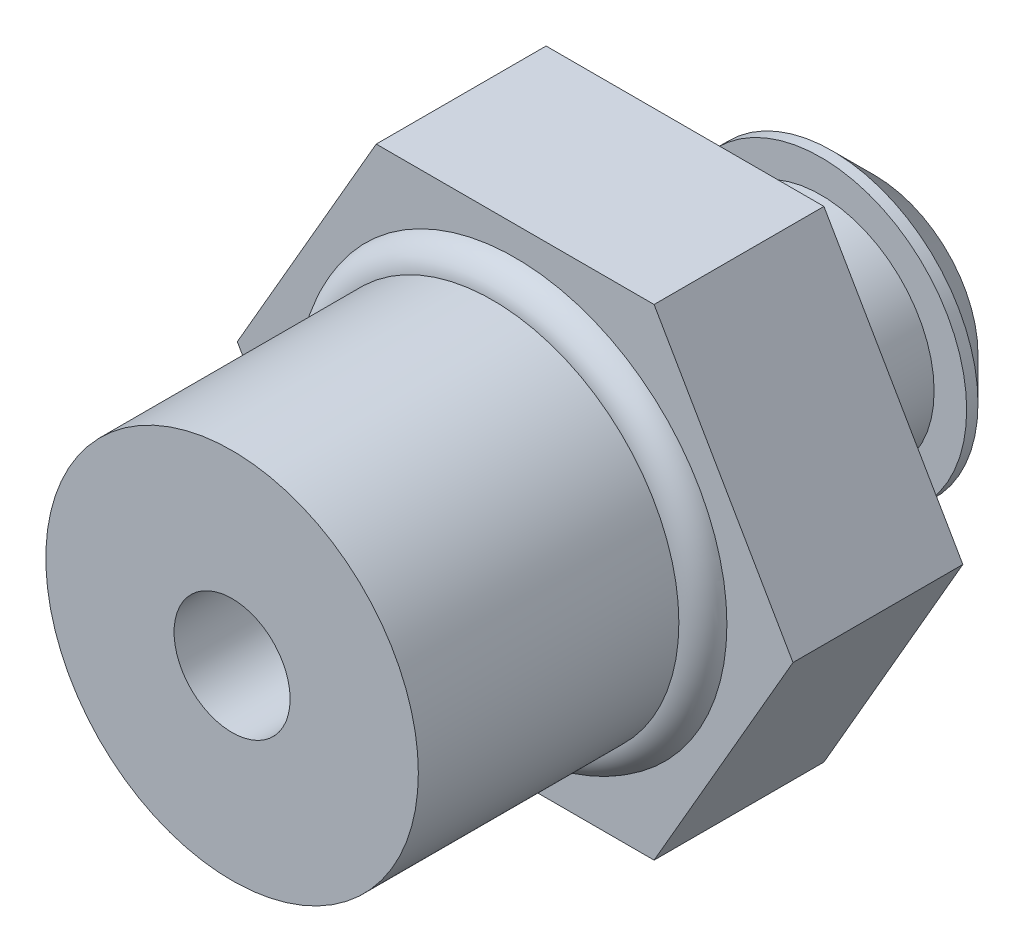
ISO-10303-21;
HEADER;
FILE_DESCRIPTION(('STEP AP214'),'2;1');
FILE_NAME('part.step','',(''),(''),'','','');
FILE_SCHEMA(('AUTOMOTIVE_DESIGN { 1 0 10303 214 1 1 1 1 }'));
ENDSEC;
DATA;
#1=APPLICATION_CONTEXT('core data for automotive mechanical design processes');
#2=APPLICATION_PROTOCOL_DEFINITION('international standard','automotive_design',2000,#1);
#3=PRODUCT_CONTEXT('',#1,'mechanical');
#4=PRODUCT('Part','Part','',(#3));
#5=PRODUCT_RELATED_PRODUCT_CATEGORY('part','',(#4));
#6=PRODUCT_DEFINITION_FORMATION('','',#4);
#7=PRODUCT_DEFINITION_CONTEXT('part definition',#1,'design');
#8=PRODUCT_DEFINITION('design','',#6,#7);
#9=PRODUCT_DEFINITION_SHAPE('','',#8);
#10=(LENGTH_UNIT() NAMED_UNIT(*) SI_UNIT(.MILLI.,.METRE.));
#11=(NAMED_UNIT(*) PLANE_ANGLE_UNIT() SI_UNIT($,.RADIAN.));
#12=(NAMED_UNIT(*) SI_UNIT($,.STERADIAN.) SOLID_ANGLE_UNIT());
#13=UNCERTAINTY_MEASURE_WITH_UNIT(LENGTH_MEASURE(1.E-05),#10,'distance_accuracy_value','');
#14=(GEOMETRIC_REPRESENTATION_CONTEXT(3) GLOBAL_UNCERTAINTY_ASSIGNED_CONTEXT((#13)) GLOBAL_UNIT_ASSIGNED_CONTEXT((#10,
#11,#12)) REPRESENTATION_CONTEXT('',''));
#15=CARTESIAN_POINT('',(0.,0.,0.));
#16=DIRECTION('',(0.,0.,1.));
#17=DIRECTION('',(1.,0.,0.));
#18=AXIS2_PLACEMENT_3D('',#15,#16,#17);
#19=CARTESIAN_POINT('',(4.90747728811182,-8.5,6.));
#20=DIRECTION('',(-0.866025403784439,0.5,0.));
#21=DIRECTION('',(0.,0.,1.));
#22=AXIS2_PLACEMENT_3D('',#19,#20,#21);
#23=PLANE('',#22);
#24=DIRECTION('',(-0.5,-0.866025403784439,0.));
#25=VECTOR('',#24,1.);
#26=CARTESIAN_POINT('',(4.98621593216773,-8.36362066797608,0.));
#27=LINE('',#26,#25);
#28=CARTESIAN_POINT('',(9.81495457622364,0.,0.));
#29=VERTEX_POINT('',#28);
#30=CARTESIAN_POINT('',(4.90747728811182,-8.5,0.));
#31=VERTEX_POINT('',#30);
#32=EDGE_CURVE('E321',#29,#31,#27,.T.);
#33=ORIENTED_EDGE('',*,*,#32,.F.);
#34=DIRECTION('',(0.,0.,1.));
#35=VECTOR('',#34,1.);
#36=CARTESIAN_POINT('',(9.81495457622364,0.,6.));
#37=LINE('',#36,#35);
#38=CARTESIAN_POINT('',(9.81495457622364,0.,6.));
#39=VERTEX_POINT('',#38);
#40=EDGE_CURVE('E11',#29,#39,#37,.T.);
#41=ORIENTED_EDGE('',*,*,#40,.T.);
#42=DIRECTION('',(0.5,0.866025403784439,0.));
#43=VECTOR('',#42,1.);
#44=CARTESIAN_POINT('',(4.90747728811182,-8.5,6.));
#45=LINE('',#44,#43);
#46=CARTESIAN_POINT('',(4.90747728811182,-8.5,6.));
#47=VERTEX_POINT('',#46);
#48=EDGE_CURVE('E219',#47,#39,#45,.T.);
#49=ORIENTED_EDGE('',*,*,#48,.F.);
#50=DIRECTION('',(0.,0.,-1.));
#51=VECTOR('',#50,1.);
#52=CARTESIAN_POINT('',(4.90747728811182,-8.5,6.));
#53=LINE('',#52,#51);
#54=EDGE_CURVE('E206',#47,#31,#53,.T.);
#55=ORIENTED_EDGE('',*,*,#54,.T.);
#56=EDGE_LOOP('',(#33,#41,#49,#55));
#57=FACE_BOUND('',#56,.T.);
#58=ADVANCED_FACE('F16',(#57),#23,.F.);
#59=CARTESIAN_POINT('',(9.81495457622364,0.,6.));
#60=DIRECTION('',(-0.866025403784439,-0.5,0.));
#61=DIRECTION('',(-0.5,0.866025403784439,0.));
#62=AXIS2_PLACEMENT_3D('',#59,#60,#61);
#63=PLANE('',#62);
#64=DIRECTION('',(0.5,-0.866025403784439,0.));
#65=VECTOR('',#64,1.);
#66=CARTESIAN_POINT('',(4.98621593216773,8.36362066797609,0.));
#67=LINE('',#66,#65);
#68=CARTESIAN_POINT('',(4.90747728811183,8.5,0.));
#69=VERTEX_POINT('',#68);
#70=EDGE_CURVE('E328',#69,#29,#67,.T.);
#71=ORIENTED_EDGE('',*,*,#70,.F.);
#72=DIRECTION('',(0.,0.,1.));
#73=VECTOR('',#72,1.);
#74=CARTESIAN_POINT('',(4.90747728811182,8.5,6.));
#75=LINE('',#74,#73);
#76=CARTESIAN_POINT('',(4.90747728811182,8.5,6.));
#77=VERTEX_POINT('',#76);
#78=EDGE_CURVE('E27',#69,#77,#75,.T.);
#79=ORIENTED_EDGE('',*,*,#78,.T.);
#80=DIRECTION('',(-0.5,0.866025403784439,0.));
#81=VECTOR('',#80,1.);
#82=CARTESIAN_POINT('',(9.81495457622364,0.,6.));
#83=LINE('',#82,#81);
#84=EDGE_CURVE('E224',#39,#77,#83,.T.);
#85=ORIENTED_EDGE('',*,*,#84,.F.);
#86=ORIENTED_EDGE('',*,*,#40,.F.);
#87=EDGE_LOOP('',(#71,#79,#85,#86));
#88=FACE_BOUND('',#87,.T.);
#89=ADVANCED_FACE('F717',(#88),#63,.F.);
#90=CARTESIAN_POINT('',(4.90747728811182,8.5,6.));
#91=DIRECTION('',(0.,-1.,0.));
#92=DIRECTION('',(-1.,0.,0.));
#93=AXIS2_PLACEMENT_3D('',#90,#91,#92);
#94=PLANE('',#93);
#95=DIRECTION('',(1.,0.,0.));
#96=VECTOR('',#95,1.);
#97=CARTESIAN_POINT('',(-9.5,8.5,0.));
#98=LINE('',#97,#96);
#99=CARTESIAN_POINT('',(-4.90747728811182,8.5,0.));
#100=VERTEX_POINT('',#99);
#101=EDGE_CURVE('E318',#100,#69,#98,.T.);
#102=ORIENTED_EDGE('',*,*,#101,.F.);
#103=DIRECTION('',(0.,0.,1.));
#104=VECTOR('',#103,1.);
#105=CARTESIAN_POINT('',(-4.90747728811182,8.5,6.));
#106=LINE('',#105,#104);
#107=CARTESIAN_POINT('',(-4.90747728811182,8.5,6.));
#108=VERTEX_POINT('',#107);
#109=EDGE_CURVE('E344',#100,#108,#106,.T.);
#110=ORIENTED_EDGE('',*,*,#109,.T.);
#111=DIRECTION('',(-1.,0.,0.));
#112=VECTOR('',#111,1.);
#113=CARTESIAN_POINT('',(4.90747728811182,8.5,6.));
#114=LINE('',#113,#112);
#115=EDGE_CURVE('E357',#77,#108,#114,.T.);
#116=ORIENTED_EDGE('',*,*,#115,.F.);
#117=ORIENTED_EDGE('',*,*,#78,.F.);
#118=EDGE_LOOP('',(#102,#110,#116,#117));
#119=FACE_BOUND('',#118,.T.);
#120=ADVANCED_FACE('F721',(#119),#94,.F.);
#121=CARTESIAN_POINT('',(-4.90747728811182,8.5,6.));
#122=DIRECTION('',(0.866025403784439,-0.5,0.));
#123=DIRECTION('',(0.,0.,-1.));
#124=AXIS2_PLACEMENT_3D('',#121,#122,#123);
#125=PLANE('',#124);
#126=DIRECTION('',(0.5,0.866025403784439,0.));
#127=VECTOR('',#126,1.);
#128=CARTESIAN_POINT('',(-9.73621593216773,0.136379332023917,0.));
#129=LINE('',#128,#127);
#130=CARTESIAN_POINT('',(-9.81495457622364,0.,0.));
#131=VERTEX_POINT('',#130);
#132=EDGE_CURVE('E310',#131,#100,#129,.T.);
#133=ORIENTED_EDGE('',*,*,#132,.F.);
#134=DIRECTION('',(0.,0.,1.));
#135=VECTOR('',#134,1.);
#136=CARTESIAN_POINT('',(-9.81495457622364,0.,6.));
#137=LINE('',#136,#135);
#138=CARTESIAN_POINT('',(-9.81495457622364,0.,6.));
#139=VERTEX_POINT('',#138);
#140=EDGE_CURVE('E347',#131,#139,#137,.T.);
#141=ORIENTED_EDGE('',*,*,#140,.T.);
#142=DIRECTION('',(-0.5,-0.866025403784439,0.));
#143=VECTOR('',#142,1.);
#144=CARTESIAN_POINT('',(-4.90747728811182,8.5,6.));
#145=LINE('',#144,#143);
#146=EDGE_CURVE('E404',#108,#139,#145,.T.);
#147=ORIENTED_EDGE('',*,*,#146,.F.);
#148=ORIENTED_EDGE('',*,*,#109,.F.);
#149=EDGE_LOOP('',(#133,#141,#147,#148));
#150=FACE_BOUND('',#149,.T.);
#151=ADVANCED_FACE('F850',(#150),#125,.F.);
#152=CARTESIAN_POINT('',(-9.81495457622364,0.,6.));
#153=DIRECTION('',(0.866025403784439,0.5,0.));
#154=DIRECTION('',(0.,0.,-1.));
#155=AXIS2_PLACEMENT_3D('',#152,#153,#154);
#156=PLANE('',#155);
#157=DIRECTION('',(-0.5,0.866025403784439,0.));
#158=VECTOR('',#157,1.);
#159=CARTESIAN_POINT('',(-9.73621593216773,-0.136379332023917,0.));
#160=LINE('',#159,#158);
#161=CARTESIAN_POINT('',(-4.90747728811182,-8.5,0.));
#162=VERTEX_POINT('',#161);
#163=EDGE_CURVE('E307',#162,#131,#160,.T.);
#164=ORIENTED_EDGE('',*,*,#163,.F.);
#165=DIRECTION('',(0.,0.,1.));
#166=VECTOR('',#165,1.);
#167=CARTESIAN_POINT('',(-4.90747728811182,-8.5,6.));
#168=LINE('',#167,#166);
#169=CARTESIAN_POINT('',(-4.90747728811182,-8.5,6.));
#170=VERTEX_POINT('',#169);
#171=EDGE_CURVE('E216',#162,#170,#168,.T.);
#172=ORIENTED_EDGE('',*,*,#171,.T.);
#173=DIRECTION('',(0.5,-0.866025403784439,0.));
#174=VECTOR('',#173,1.);
#175=CARTESIAN_POINT('',(-9.81495457622364,0.,6.));
#176=LINE('',#175,#174);
#177=EDGE_CURVE('E230',#139,#170,#176,.T.);
#178=ORIENTED_EDGE('',*,*,#177,.F.);
#179=ORIENTED_EDGE('',*,*,#140,.F.);
#180=EDGE_LOOP('',(#164,#172,#178,#179));
#181=FACE_BOUND('',#180,.T.);
#182=ADVANCED_FACE('F846',(#181),#156,.F.);
#183=CARTESIAN_POINT('',(-4.90747728811182,-8.5,6.));
#184=DIRECTION('',(0.,1.,0.));
#185=DIRECTION('',(1.,0.,0.));
#186=AXIS2_PLACEMENT_3D('',#183,#184,#185);
#187=PLANE('',#186);
#188=DIRECTION('',(-1.,0.,0.));
#189=VECTOR('',#188,1.);
#190=CARTESIAN_POINT('',(-9.5,-8.5,0.));
#191=LINE('',#190,#189);
#192=EDGE_CURVE('E211',#31,#162,#191,.T.);
#193=ORIENTED_EDGE('',*,*,#192,.F.);
#194=ORIENTED_EDGE('',*,*,#54,.F.);
#195=DIRECTION('',(1.,0.,0.));
#196=VECTOR('',#195,1.);
#197=CARTESIAN_POINT('',(-4.90747728811182,-8.5,6.));
#198=LINE('',#197,#196);
#199=EDGE_CURVE('E209',#170,#47,#198,.T.);
#200=ORIENTED_EDGE('',*,*,#199,.F.);
#201=ORIENTED_EDGE('',*,*,#171,.F.);
#202=EDGE_LOOP('',(#193,#194,#200,#201));
#203=FACE_BOUND('',#202,.T.);
#204=ADVANCED_FACE('F18',(#203),#187,.F.);
#205=CARTESIAN_POINT('',(2.30940107675851,0.,-0.7));
#206=DIRECTION('',(0.866025403784439,-0.5,0.));
#207=DIRECTION('',(0.,0.,-1.));
#208=AXIS2_PLACEMENT_3D('',#205,#206,#207);
#209=PLANE('',#208);
#210=DIRECTION('',(-0.5,-0.866025403784439,0.));
#211=VECTOR('',#210,1.);
#212=CARTESIAN_POINT('',(2.30940107675851,0.,-6.7));
#213=LINE('',#212,#211);
#214=CARTESIAN_POINT('',(2.30940107675851,0.,-6.7));
#215=VERTEX_POINT('',#214);
#216=CARTESIAN_POINT('',(1.15470053837925,-2.,-6.7));
#217=VERTEX_POINT('',#216);
#218=EDGE_CURVE('E333',#215,#217,#213,.T.);
#219=ORIENTED_EDGE('',*,*,#218,.T.);
#220=DIRECTION('',(0.,0.,-1.));
#221=VECTOR('',#220,1.);
#222=CARTESIAN_POINT('',(1.15470053837925,-2.,-0.7));
#223=LINE('',#222,#221);
#224=CARTESIAN_POINT('',(1.15470053837925,-2.,-0.7));
#225=VERTEX_POINT('',#224);
#226=EDGE_CURVE('E143',#225,#217,#223,.T.);
#227=ORIENTED_EDGE('',*,*,#226,.F.);
#228=DIRECTION('',(-0.5,-0.866025403784439,0.));
#229=VECTOR('',#228,1.);
#230=CARTESIAN_POINT('',(2.30940107675851,0.,-0.7));
#231=LINE('',#230,#229);
#232=CARTESIAN_POINT('',(1.50705080756889,-1.38971143170299,-0.7));
#233=VERTEX_POINT('',#232);
#234=EDGE_CURVE('E365',#233,#225,#231,.T.);
#235=ORIENTED_EDGE('',*,*,#234,.F.);
#236=DIRECTION('',(-0.5,-0.866025403784439,0.));
#237=VECTOR('',#236,1.);
#238=CARTESIAN_POINT('',(2.30940107675851,0.,-0.7));
#239=LINE('',#238,#237);
#240=CARTESIAN_POINT('',(1.95705080756887,-0.610288568297012,-0.7));
#241=VERTEX_POINT('',#240);
#242=EDGE_CURVE('E246',#241,#233,#239,.T.);
#243=ORIENTED_EDGE('',*,*,#242,.F.);
#244=DIRECTION('',(-0.5,-0.866025403784439,0.));
#245=VECTOR('',#244,1.);
#246=CARTESIAN_POINT('',(2.30940107675851,0.,-0.7));
#247=LINE('',#246,#245);
#248=CARTESIAN_POINT('',(2.30940107675851,0.,-0.7));
#249=VERTEX_POINT('',#248);
#250=EDGE_CURVE('E283',#249,#241,#247,.T.);
#251=ORIENTED_EDGE('',*,*,#250,.F.);
#252=DIRECTION('',(0.,0.,-1.));
#253=VECTOR('',#252,1.);
#254=CARTESIAN_POINT('',(2.30940107675851,0.,-0.7));
#255=LINE('',#254,#253);
#256=EDGE_CURVE('E354',#249,#215,#255,.T.);
#257=ORIENTED_EDGE('',*,*,#256,.T.);
#258=EDGE_LOOP('',(#219,#227,#235,#243,#251,#257));
#259=FACE_BOUND('',#258,.T.);
#260=ADVANCED_FACE('F510',(#259),#209,.F.);
#261=CARTESIAN_POINT('',(1.15470053837925,-2.,-0.7));
#262=DIRECTION('',(0.,-1.,0.));
#263=DIRECTION('',(0.,0.,-1.));
#264=AXIS2_PLACEMENT_3D('',#261,#262,#263);
#265=PLANE('',#264);
#266=DIRECTION('',(-1.,0.,0.));
#267=VECTOR('',#266,1.);
#268=CARTESIAN_POINT('',(1.15470053837925,-2.,-6.7));
#269=LINE('',#268,#267);
#270=CARTESIAN_POINT('',(-1.15470053837925,-2.,-6.7));
#271=VERTEX_POINT('',#270);
#272=EDGE_CURVE('E250',#217,#271,#269,.T.);
#273=ORIENTED_EDGE('',*,*,#272,.T.);
#274=DIRECTION('',(0.,0.,-1.));
#275=VECTOR('',#274,1.);
#276=CARTESIAN_POINT('',(-1.15470053837925,-2.,-0.7));
#277=LINE('',#276,#275);
#278=CARTESIAN_POINT('',(-1.15470053837925,-2.,-0.7));
#279=VERTEX_POINT('',#278);
#280=EDGE_CURVE('E20',#279,#271,#277,.T.);
#281=ORIENTED_EDGE('',*,*,#280,.F.);
#282=DIRECTION('',(-1.,0.,0.));
#283=VECTOR('',#282,1.);
#284=CARTESIAN_POINT('',(1.15470053837925,-2.,-0.7));
#285=LINE('',#284,#283);
#286=CARTESIAN_POINT('',(-0.449999999999988,-2.,-0.7));
#287=VERTEX_POINT('',#286);
#288=EDGE_CURVE('E249',#287,#279,#285,.T.);
#289=ORIENTED_EDGE('',*,*,#288,.F.);
#290=DIRECTION('',(-1.,0.,0.));
#291=VECTOR('',#290,1.);
#292=CARTESIAN_POINT('',(1.15470053837925,-2.,-0.7));
#293=LINE('',#292,#291);
#294=CARTESIAN_POINT('',(0.449999999999989,-2.,-0.7));
#295=VERTEX_POINT('',#294);
#296=EDGE_CURVE('E232',#295,#287,#293,.T.);
#297=ORIENTED_EDGE('',*,*,#296,.F.);
#298=DIRECTION('',(-1.,0.,0.));
#299=VECTOR('',#298,1.);
#300=CARTESIAN_POINT('',(1.15470053837925,-2.,-0.7));
#301=LINE('',#300,#299);
#302=EDGE_CURVE('E363',#225,#295,#301,.T.);
#303=ORIENTED_EDGE('',*,*,#302,.F.);
#304=ORIENTED_EDGE('',*,*,#226,.T.);
#305=EDGE_LOOP('',(#273,#281,#289,#297,#303,#304));
#306=FACE_BOUND('',#305,.T.);
#307=ADVANCED_FACE('F627',(#306),#265,.F.);
#308=CARTESIAN_POINT('',(-1.15470053837925,-2.,-0.7));
#309=DIRECTION('',(-0.866025403784439,-0.5,0.));
#310=DIRECTION('',(-0.5,0.866025403784439,0.));
#311=AXIS2_PLACEMENT_3D('',#308,#309,#310);
#312=PLANE('',#311);
#313=DIRECTION('',(-0.5,0.866025403784439,0.));
#314=VECTOR('',#313,1.);
#315=CARTESIAN_POINT('',(-1.15470053837925,-2.,-6.7));
#316=LINE('',#315,#314);
#317=CARTESIAN_POINT('',(-2.3094010767585,0.,-6.7));
#318=VERTEX_POINT('',#317);
#319=EDGE_CURVE('E251',#271,#318,#316,.T.);
#320=ORIENTED_EDGE('',*,*,#319,.T.);
#321=DIRECTION('',(0.,0.,-1.));
#322=VECTOR('',#321,1.);
#323=CARTESIAN_POINT('',(-2.3094010767585,0.,-0.7));
#324=LINE('',#323,#322);
#325=CARTESIAN_POINT('',(-2.3094010767585,0.,-0.7));
#326=VERTEX_POINT('',#325);
#327=EDGE_CURVE('E42',#326,#318,#324,.T.);
#328=ORIENTED_EDGE('',*,*,#327,.F.);
#329=DIRECTION('',(-0.5,0.866025403784439,0.));
#330=VECTOR('',#329,1.);
#331=CARTESIAN_POINT('',(-1.15470053837925,-2.,-0.7));
#332=LINE('',#331,#330);
#333=CARTESIAN_POINT('',(-1.95705080756887,-0.610288568297001,-0.7));
#334=VERTEX_POINT('',#333);
#335=EDGE_CURVE('E292',#334,#326,#332,.T.);
#336=ORIENTED_EDGE('',*,*,#335,.F.);
#337=DIRECTION('',(-0.5,0.866025403784439,0.));
#338=VECTOR('',#337,1.);
#339=CARTESIAN_POINT('',(-1.15470053837925,-2.,-0.7));
#340=LINE('',#339,#338);
#341=CARTESIAN_POINT('',(-1.50705080756888,-1.38971143170299,-0.7));
#342=VERTEX_POINT('',#341);
#343=EDGE_CURVE('E240',#342,#334,#340,.T.);
#344=ORIENTED_EDGE('',*,*,#343,.F.);
#345=DIRECTION('',(-0.5,0.866025403784439,0.));
#346=VECTOR('',#345,1.);
#347=CARTESIAN_POINT('',(-1.15470053837925,-2.,-0.7));
#348=LINE('',#347,#346);
#349=EDGE_CURVE('E419',#279,#342,#348,.T.);
#350=ORIENTED_EDGE('',*,*,#349,.F.);
#351=ORIENTED_EDGE('',*,*,#280,.T.);
#352=EDGE_LOOP('',(#320,#328,#336,#344,#350,#351));
#353=FACE_BOUND('',#352,.T.);
#354=ADVANCED_FACE('F631',(#353),#312,.F.);
#355=CARTESIAN_POINT('',(-2.3094010767585,0.,-0.7));
#356=DIRECTION('',(-0.866025403784439,0.5,0.));
#357=DIRECTION('',(0.,0.,1.));
#358=AXIS2_PLACEMENT_3D('',#355,#356,#357);
#359=PLANE('',#358);
#360=DIRECTION('',(0.5,0.866025403784439,0.));
#361=VECTOR('',#360,1.);
#362=CARTESIAN_POINT('',(-2.3094010767585,0.,-6.7));
#363=LINE('',#362,#361);
#364=CARTESIAN_POINT('',(-1.15470053837925,2.,-6.7));
#365=VERTEX_POINT('',#364);
#366=EDGE_CURVE('E254',#318,#365,#363,.T.);
#367=ORIENTED_EDGE('',*,*,#366,.T.);
#368=DIRECTION('',(0.,0.,-1.));
#369=VECTOR('',#368,1.);
#370=CARTESIAN_POINT('',(-1.15470053837925,2.,-0.7));
#371=LINE('',#370,#369);
#372=CARTESIAN_POINT('',(-1.15470053837925,2.,-0.7));
#373=VERTEX_POINT('',#372);
#374=EDGE_CURVE('E265',#373,#365,#371,.T.);
#375=ORIENTED_EDGE('',*,*,#374,.F.);
#376=DIRECTION('',(0.5,0.866025403784439,0.));
#377=VECTOR('',#376,1.);
#378=CARTESIAN_POINT('',(-2.3094010767585,0.,-0.7));
#379=LINE('',#378,#377);
#380=CARTESIAN_POINT('',(-1.50705080756888,1.38971143170299,-0.7));
#381=VERTEX_POINT('',#380);
#382=EDGE_CURVE('E258',#381,#373,#379,.T.);
#383=ORIENTED_EDGE('',*,*,#382,.F.);
#384=DIRECTION('',(0.5,0.866025403784439,0.));
#385=VECTOR('',#384,1.);
#386=CARTESIAN_POINT('',(-2.3094010767585,0.,-0.7));
#387=LINE('',#386,#385);
#388=CARTESIAN_POINT('',(-1.95705080756887,0.610288568297003,-0.7));
#389=VERTEX_POINT('',#388);
#390=EDGE_CURVE('E284',#389,#381,#387,.T.);
#391=ORIENTED_EDGE('',*,*,#390,.F.);
#392=DIRECTION('',(0.5,0.866025403784439,0.));
#393=VECTOR('',#392,1.);
#394=CARTESIAN_POINT('',(-2.3094010767585,0.,-0.7));
#395=LINE('',#394,#393);
#396=EDGE_CURVE('E387',#326,#389,#395,.T.);
#397=ORIENTED_EDGE('',*,*,#396,.F.);
#398=ORIENTED_EDGE('',*,*,#327,.T.);
#399=EDGE_LOOP('',(#367,#375,#383,#391,#397,#398));
#400=FACE_BOUND('',#399,.T.);
#401=ADVANCED_FACE('F460',(#400),#359,.F.);
#402=CARTESIAN_POINT('',(-1.15470053837925,2.,-0.7));
#403=DIRECTION('',(0.,1.,0.));
#404=DIRECTION('',(1.,0.,0.));
#405=AXIS2_PLACEMENT_3D('',#402,#403,#404);
#406=PLANE('',#405);
#407=DIRECTION('',(1.,0.,0.));
#408=VECTOR('',#407,1.);
#409=CARTESIAN_POINT('',(-1.15470053837925,2.,-6.7));
#410=LINE('',#409,#408);
#411=CARTESIAN_POINT('',(1.15470053837925,2.,-6.7));
#412=VERTEX_POINT('',#411);
#413=EDGE_CURVE('E275',#365,#412,#410,.T.);
#414=ORIENTED_EDGE('',*,*,#413,.T.);
#415=DIRECTION('',(0.,0.,-1.));
#416=VECTOR('',#415,1.);
#417=CARTESIAN_POINT('',(1.15470053837925,2.,-0.7));
#418=LINE('',#417,#416);
#419=CARTESIAN_POINT('',(1.15470053837925,2.,-0.7));
#420=VERTEX_POINT('',#419);
#421=EDGE_CURVE('E268',#420,#412,#418,.T.);
#422=ORIENTED_EDGE('',*,*,#421,.F.);
#423=DIRECTION('',(1.,0.,0.));
#424=VECTOR('',#423,1.);
#425=CARTESIAN_POINT('',(-1.15470053837925,2.,-0.7));
#426=LINE('',#425,#424);
#427=CARTESIAN_POINT('',(0.449999999999989,2.,-0.7));
#428=VERTEX_POINT('',#427);
#429=EDGE_CURVE('E259',#428,#420,#426,.T.);
#430=ORIENTED_EDGE('',*,*,#429,.F.);
#431=DIRECTION('',(1.,0.,0.));
#432=VECTOR('',#431,1.);
#433=CARTESIAN_POINT('',(-1.15470053837925,2.,-0.7));
#434=LINE('',#433,#432);
#435=CARTESIAN_POINT('',(-0.449999999999989,2.,-0.7));
#436=VERTEX_POINT('',#435);
#437=EDGE_CURVE('E288',#436,#428,#434,.T.);
#438=ORIENTED_EDGE('',*,*,#437,.F.);
#439=DIRECTION('',(1.,0.,0.));
#440=VECTOR('',#439,1.);
#441=CARTESIAN_POINT('',(-1.15470053837925,2.,-0.7));
#442=LINE('',#441,#440);
#443=EDGE_CURVE('E289',#373,#436,#442,.T.);
#444=ORIENTED_EDGE('',*,*,#443,.F.);
#445=ORIENTED_EDGE('',*,*,#374,.T.);
#446=EDGE_LOOP('',(#414,#422,#430,#438,#444,#445));
#447=FACE_BOUND('',#446,.T.);
#448=ADVANCED_FACE('F455',(#447),#406,.F.);
#449=CARTESIAN_POINT('',(1.15470053837925,2.,-0.7));
#450=DIRECTION('',(0.866025403784439,0.5,0.));
#451=DIRECTION('',(0.,0.,-1.));
#452=AXIS2_PLACEMENT_3D('',#449,#450,#451);
#453=PLANE('',#452);
#454=DIRECTION('',(0.5,-0.866025403784439,0.));
#455=VECTOR('',#454,1.);
#456=CARTESIAN_POINT('',(1.15470053837925,2.,-6.7));
#457=LINE('',#456,#455);
#458=EDGE_CURVE('E279',#412,#215,#457,.T.);
#459=ORIENTED_EDGE('',*,*,#458,.T.);
#460=ORIENTED_EDGE('',*,*,#256,.F.);
#461=DIRECTION('',(0.5,-0.866025403784439,0.));
#462=VECTOR('',#461,1.);
#463=CARTESIAN_POINT('',(1.15470053837925,2.,-0.7));
#464=LINE('',#463,#462);
#465=CARTESIAN_POINT('',(1.95705080756887,0.610288568297011,-0.7));
#466=VERTEX_POINT('',#465);
#467=EDGE_CURVE('E360',#466,#249,#464,.T.);
#468=ORIENTED_EDGE('',*,*,#467,.F.);
#469=DIRECTION('',(0.5,-0.866025403784439,0.));
#470=VECTOR('',#469,1.);
#471=CARTESIAN_POINT('',(1.15470053837925,2.,-0.7));
#472=LINE('',#471,#470);
#473=CARTESIAN_POINT('',(1.50705080756888,1.38971143170299,-0.7));
#474=VERTEX_POINT('',#473);
#475=EDGE_CURVE('E263',#474,#466,#472,.T.);
#476=ORIENTED_EDGE('',*,*,#475,.F.);
#477=DIRECTION('',(0.5,-0.866025403784439,0.));
#478=VECTOR('',#477,1.);
#479=CARTESIAN_POINT('',(1.15470053837925,2.,-0.7));
#480=LINE('',#479,#478);
#481=EDGE_CURVE('E255',#420,#474,#480,.T.);
#482=ORIENTED_EDGE('',*,*,#481,.F.);
#483=ORIENTED_EDGE('',*,*,#421,.T.);
#484=EDGE_LOOP('',(#459,#460,#468,#476,#482,#483));
#485=FACE_BOUND('',#484,.T.);
#486=ADVANCED_FACE('F513',(#485),#453,.F.);
#487=CARTESIAN_POINT('',(0.,0.,-0.7));
#488=DIRECTION('',(0.,0.,-1.));
#489=DIRECTION('',(0.,-1.,0.));
#490=AXIS2_PLACEMENT_3D('',#487,#488,#489);
#491=PLANE('',#490);
#492=CARTESIAN_POINT('',(0.,0.,-0.7));
#493=DIRECTION('',(0.,0.,1.));
#494=DIRECTION('',(1.,0.,0.));
#495=AXIS2_PLACEMENT_3D('',#492,#493,#494);
#496=CIRCLE('',#495,2.05);
#497=EDGE_CURVE('E305',#389,#334,#496,.T.);
#498=ORIENTED_EDGE('',*,*,#497,.T.);
#499=ORIENTED_EDGE('',*,*,#335,.T.);
#500=ORIENTED_EDGE('',*,*,#396,.T.);
#501=EDGE_LOOP('',(#498,#499,#500));
#502=FACE_BOUND('',#501,.T.);
#503=ADVANCED_FACE('F646',(#502),#491,.T.);
#504=CARTESIAN_POINT('',(0.,0.,-0.7));
#505=DIRECTION('',(0.,0.,-1.));
#506=DIRECTION('',(0.,-1.,0.));
#507=AXIS2_PLACEMENT_3D('',#504,#505,#506);
#508=PLANE('',#507);
#509=CARTESIAN_POINT('',(0.,0.,-0.7));
#510=DIRECTION('',(0.,0.,1.));
#511=DIRECTION('',(1.,0.,0.));
#512=AXIS2_PLACEMENT_3D('',#509,#510,#511);
#513=CIRCLE('',#512,2.05);
#514=EDGE_CURVE('E244',#436,#381,#513,.T.);
#515=ORIENTED_EDGE('',*,*,#514,.T.);
#516=ORIENTED_EDGE('',*,*,#382,.T.);
#517=ORIENTED_EDGE('',*,*,#443,.T.);
#518=EDGE_LOOP('',(#515,#516,#517));
#519=FACE_BOUND('',#518,.T.);
#520=ADVANCED_FACE('F454',(#519),#508,.T.);
#521=CARTESIAN_POINT('',(0.,0.,-0.7));
#522=DIRECTION('',(0.,0.,-1.));
#523=DIRECTION('',(0.,-1.,0.));
#524=AXIS2_PLACEMENT_3D('',#521,#522,#523);
#525=PLANE('',#524);
#526=CARTESIAN_POINT('',(0.,0.,-0.7));
#527=DIRECTION('',(0.,0.,1.));
#528=DIRECTION('',(1.,0.,0.));
#529=AXIS2_PLACEMENT_3D('',#526,#527,#528);
#530=CIRCLE('',#529,2.05);
#531=EDGE_CURVE('E269',#474,#428,#530,.T.);
#532=ORIENTED_EDGE('',*,*,#531,.T.);
#533=ORIENTED_EDGE('',*,*,#429,.T.);
#534=ORIENTED_EDGE('',*,*,#481,.T.);
#535=EDGE_LOOP('',(#532,#533,#534));
#536=FACE_BOUND('',#535,.T.);
#537=ADVANCED_FACE('F445',(#536),#525,.T.);
#538=CARTESIAN_POINT('',(0.,0.,-0.7));
#539=DIRECTION('',(0.,0.,-1.));
#540=DIRECTION('',(0.,-1.,0.));
#541=AXIS2_PLACEMENT_3D('',#538,#539,#540);
#542=PLANE('',#541);
#543=CARTESIAN_POINT('',(0.,0.,-0.7));
#544=DIRECTION('',(0.,0.,1.));
#545=DIRECTION('',(1.,0.,0.));
#546=AXIS2_PLACEMENT_3D('',#543,#544,#545);
#547=CIRCLE('',#546,2.05);
#548=EDGE_CURVE('E297',#241,#466,#547,.T.);
#549=ORIENTED_EDGE('',*,*,#548,.T.);
#550=ORIENTED_EDGE('',*,*,#467,.T.);
#551=ORIENTED_EDGE('',*,*,#250,.T.);
#552=EDGE_LOOP('',(#549,#550,#551));
#553=FACE_BOUND('',#552,.T.);
#554=ADVANCED_FACE('F520',(#553),#542,.T.);
#555=CARTESIAN_POINT('',(0.,0.,-0.7));
#556=DIRECTION('',(0.,0.,-1.));
#557=DIRECTION('',(0.,-1.,0.));
#558=AXIS2_PLACEMENT_3D('',#555,#556,#557);
#559=PLANE('',#558);
#560=CARTESIAN_POINT('',(0.,0.,-0.7));
#561=DIRECTION('',(0.,0.,1.));
#562=DIRECTION('',(1.,0.,0.));
#563=AXIS2_PLACEMENT_3D('',#560,#561,#562);
#564=CIRCLE('',#563,2.05);
#565=EDGE_CURVE('E393',#295,#233,#564,.T.);
#566=ORIENTED_EDGE('',*,*,#565,.T.);
#567=ORIENTED_EDGE('',*,*,#234,.T.);
#568=ORIENTED_EDGE('',*,*,#302,.T.);
#569=EDGE_LOOP('',(#566,#567,#568));
#570=FACE_BOUND('',#569,.T.);
#571=ADVANCED_FACE('F673',(#570),#559,.T.);
#572=CARTESIAN_POINT('',(0.,0.,-0.7));
#573=DIRECTION('',(0.,0.,-1.));
#574=DIRECTION('',(0.,-1.,0.));
#575=AXIS2_PLACEMENT_3D('',#572,#573,#574);
#576=PLANE('',#575);
#577=CARTESIAN_POINT('',(0.,0.,-0.7));
#578=DIRECTION('',(0.,0.,1.));
#579=DIRECTION('',(1.,0.,0.));
#580=AXIS2_PLACEMENT_3D('',#577,#578,#579);
#581=CIRCLE('',#580,2.05);
#582=EDGE_CURVE('E306',#342,#287,#581,.T.);
#583=ORIENTED_EDGE('',*,*,#582,.T.);
#584=ORIENTED_EDGE('',*,*,#288,.T.);
#585=ORIENTED_EDGE('',*,*,#349,.T.);
#586=EDGE_LOOP('',(#583,#584,#585));
#587=FACE_BOUND('',#586,.T.);
#588=ADVANCED_FACE('F654',(#587),#576,.T.);
#589=CARTESIAN_POINT('',(-1.25,0.,-0.7));
#590=DIRECTION('',(0.,0.,-1.));
#591=DIRECTION('',(0.,-1.,0.));
#592=AXIS2_PLACEMENT_3D('',#589,#590,#591);
#593=PLANE('',#592);
#594=CARTESIAN_POINT('',(0.,0.,-0.7));
#595=DIRECTION('',(0.,0.,1.));
#596=DIRECTION('',(1.,0.,0.));
#597=AXIS2_PLACEMENT_3D('',#594,#595,#596);
#598=CIRCLE('',#597,2.05);
#599=EDGE_CURVE('E301',#233,#241,#598,.T.);
#600=ORIENTED_EDGE('',*,*,#599,.T.);
#601=ORIENTED_EDGE('',*,*,#242,.T.);
#602=EDGE_LOOP('',(#600,#601));
#603=FACE_BOUND('',#602,.T.);
#604=ADVANCED_FACE('F523',(#603),#593,.F.);
#605=CARTESIAN_POINT('',(-3.65,0.,-6.7));
#606=DIRECTION('',(0.,0.,1.));
#607=DIRECTION('',(1.,0.,0.));
#608=AXIS2_PLACEMENT_3D('',#605,#606,#607);
#609=PLANE('',#608);
#610=ORIENTED_EDGE('',*,*,#218,.F.);
#611=ORIENTED_EDGE('',*,*,#458,.F.);
#612=ORIENTED_EDGE('',*,*,#413,.F.);
#613=ORIENTED_EDGE('',*,*,#366,.F.);
#614=ORIENTED_EDGE('',*,*,#319,.F.);
#615=ORIENTED_EDGE('',*,*,#272,.F.);
#616=EDGE_LOOP('',(#610,#611,#612,#613,#614,#615));
#617=FACE_BOUND('',#616,.T.);
#618=CARTESIAN_POINT('',(0.,0.,-6.7));
#619=DIRECTION('',(0.,0.,1.));
#620=DIRECTION('',(1.,0.,0.));
#621=AXIS2_PLACEMENT_3D('',#618,#619,#620);
#622=CIRCLE('',#621,3.65);
#623=CARTESIAN_POINT('',(-3.65,0.,-6.7));
#624=VERTEX_POINT('',#623);
#625=EDGE_CURVE('E335',#624,#624,#622,.T.);
#626=ORIENTED_EDGE('',*,*,#625,.F.);
#627=EDGE_LOOP('',(#626));
#628=FACE_BOUND('',#627,.T.);
#629=ADVANCED_FACE('F464',(#617,#628),#609,.F.);
#630=CARTESIAN_POINT('',(-4.,0.,-4.8));
#631=DIRECTION('',(0.,0.,-1.));
#632=DIRECTION('',(0.,-1.,0.));
#633=AXIS2_PLACEMENT_3D('',#630,#631,#632);
#634=PLANE('',#633);
#635=CARTESIAN_POINT('',(0.,0.,-4.8));
#636=DIRECTION('',(0.,0.,1.));
#637=DIRECTION('',(1.,0.,0.));
#638=AXIS2_PLACEMENT_3D('',#635,#636,#637);
#639=CIRCLE('',#638,4.);
#640=CARTESIAN_POINT('',(-4.,0.,-4.8));
#641=VERTEX_POINT('',#640);
#642=EDGE_CURVE('E403',#641,#641,#639,.T.);
#643=ORIENTED_EDGE('',*,*,#642,.F.);
#644=EDGE_LOOP('',(#643));
#645=FACE_BOUND('',#644,.T.);
#646=CARTESIAN_POINT('',(0.,0.,-4.79999999999994));
#647=DIRECTION('',(0.,0.,1.));
#648=DIRECTION('',(1.,0.,0.));
#649=AXIS2_PLACEMENT_3D('',#646,#647,#648);
#650=CIRCLE('',#649,5.15);
#651=CARTESIAN_POINT('',(5.15,0.,-4.79999999999994));
#652=VERTEX_POINT('',#651);
#653=EDGE_CURVE('E431',#652,#652,#650,.T.);
#654=ORIENTED_EDGE('',*,*,#653,.T.);
#655=EDGE_LOOP('',(#654));
#656=FACE_BOUND('',#655,.T.);
#657=ADVANCED_FACE('F622',(#645,#656),#634,.F.);
#658=CARTESIAN_POINT('',(-9.5,0.,0.));
#659=DIRECTION('',(0.,0.,1.));
#660=DIRECTION('',(1.,0.,0.));
#661=AXIS2_PLACEMENT_3D('',#658,#659,#660);
#662=PLANE('',#661);
#663=CARTESIAN_POINT('',(0.,0.,0.));
#664=DIRECTION('',(0.,0.,1.));
#665=DIRECTION('',(1.,0.,0.));
#666=AXIS2_PLACEMENT_3D('',#663,#664,#665);
#667=CIRCLE('',#666,4.);
#668=CARTESIAN_POINT('',(4.,0.,0.));
#669=VERTEX_POINT('',#668);
#670=EDGE_CURVE('E296',#669,#669,#667,.T.);
#671=ORIENTED_EDGE('',*,*,#670,.T.);
#672=EDGE_LOOP('',(#671));
#673=FACE_BOUND('',#672,.T.);
#674=ORIENTED_EDGE('',*,*,#70,.T.);
#675=ORIENTED_EDGE('',*,*,#32,.T.);
#676=ORIENTED_EDGE('',*,*,#192,.T.);
#677=ORIENTED_EDGE('',*,*,#163,.T.);
#678=ORIENTED_EDGE('',*,*,#132,.T.);
#679=ORIENTED_EDGE('',*,*,#101,.T.);
#680=EDGE_LOOP('',(#674,#675,#676,#677,#678,#679));
#681=FACE_BOUND('',#680,.T.);
#682=ADVANCED_FACE('F752',(#673,#681),#662,.F.);
#683=CARTESIAN_POINT('',(-5.65,0.,6.));
#684=DIRECTION('',(0.,0.,-1.));
#685=DIRECTION('',(0.,-1.,0.));
#686=AXIS2_PLACEMENT_3D('',#683,#684,#685);
#687=PLANE('',#686);
#688=CARTESIAN_POINT('',(0.,0.,6.));
#689=DIRECTION('',(0.,0.,-1.));
#690=DIRECTION('',(-1.,0.,0.));
#691=AXIS2_PLACEMENT_3D('',#688,#689,#690);
#692=CIRCLE('',#691,7.47979589711327);
#693=CARTESIAN_POINT('',(-7.47979589711327,0.,6.));
#694=VERTEX_POINT('',#693);
#695=EDGE_CURVE('E260',#694,#694,#692,.T.);
#696=ORIENTED_EDGE('',*,*,#695,.T.);
#697=EDGE_LOOP('',(#696));
#698=FACE_BOUND('',#697,.T.);
#699=ORIENTED_EDGE('',*,*,#199,.T.);
#700=ORIENTED_EDGE('',*,*,#48,.T.);
#701=ORIENTED_EDGE('',*,*,#84,.T.);
#702=ORIENTED_EDGE('',*,*,#115,.T.);
#703=ORIENTED_EDGE('',*,*,#146,.T.);
#704=ORIENTED_EDGE('',*,*,#177,.T.);
#705=EDGE_LOOP('',(#699,#700,#701,#702,#703,#704));
#706=FACE_BOUND('',#705,.T.);
#707=ADVANCED_FACE('F227',(#698,#706),#687,.F.);
#708=CARTESIAN_POINT('',(-1.25,0.,-0.7));
#709=DIRECTION('',(0.,0.,-1.));
#710=DIRECTION('',(0.,-1.,0.));
#711=AXIS2_PLACEMENT_3D('',#708,#709,#710);
#712=PLANE('',#711);
#713=CARTESIAN_POINT('',(0.,0.,-0.7));
#714=DIRECTION('',(0.,0.,1.));
#715=DIRECTION('',(1.,0.,0.));
#716=AXIS2_PLACEMENT_3D('',#713,#714,#715);
#717=CIRCLE('',#716,2.05);
#718=EDGE_CURVE('E397',#287,#295,#717,.T.);
#719=ORIENTED_EDGE('',*,*,#718,.T.);
#720=ORIENTED_EDGE('',*,*,#296,.T.);
#721=EDGE_LOOP('',(#719,#720));
#722=FACE_BOUND('',#721,.T.);
#723=ADVANCED_FACE('F734',(#722),#712,.F.);
#724=CARTESIAN_POINT('',(-1.25,0.,-0.7));
#725=DIRECTION('',(0.,0.,-1.));
#726=DIRECTION('',(0.,-1.,0.));
#727=AXIS2_PLACEMENT_3D('',#724,#725,#726);
#728=PLANE('',#727);
#729=CARTESIAN_POINT('',(0.,0.,-0.7));
#730=DIRECTION('',(0.,0.,1.));
#731=DIRECTION('',(1.,0.,0.));
#732=AXIS2_PLACEMENT_3D('',#729,#730,#731);
#733=CIRCLE('',#732,2.05);
#734=EDGE_CURVE('E302',#334,#342,#733,.T.);
#735=ORIENTED_EDGE('',*,*,#734,.T.);
#736=ORIENTED_EDGE('',*,*,#343,.T.);
#737=EDGE_LOOP('',(#735,#736));
#738=FACE_BOUND('',#737,.T.);
#739=ADVANCED_FACE('F738',(#738),#728,.F.);
#740=CARTESIAN_POINT('',(-1.25,0.,-0.7));
#741=DIRECTION('',(0.,0.,-1.));
#742=DIRECTION('',(0.,-1.,0.));
#743=AXIS2_PLACEMENT_3D('',#740,#741,#742);
#744=PLANE('',#743);
#745=CARTESIAN_POINT('',(0.,0.,-0.7));
#746=DIRECTION('',(0.,0.,1.));
#747=DIRECTION('',(1.,0.,0.));
#748=AXIS2_PLACEMENT_3D('',#745,#746,#747);
#749=CIRCLE('',#748,2.05);
#750=EDGE_CURVE('E366',#381,#389,#749,.T.);
#751=ORIENTED_EDGE('',*,*,#750,.T.);
#752=ORIENTED_EDGE('',*,*,#390,.T.);
#753=EDGE_LOOP('',(#751,#752));
#754=FACE_BOUND('',#753,.T.);
#755=ADVANCED_FACE('F744',(#754),#744,.F.);
#756=CARTESIAN_POINT('',(-1.25,0.,-0.7));
#757=DIRECTION('',(0.,0.,-1.));
#758=DIRECTION('',(0.,-1.,0.));
#759=AXIS2_PLACEMENT_3D('',#756,#757,#758);
#760=PLANE('',#759);
#761=CARTESIAN_POINT('',(0.,0.,-0.7));
#762=DIRECTION('',(0.,0.,1.));
#763=DIRECTION('',(1.,0.,0.));
#764=AXIS2_PLACEMENT_3D('',#761,#762,#763);
#765=CIRCLE('',#764,2.05);
#766=EDGE_CURVE('E274',#428,#436,#765,.T.);
#767=ORIENTED_EDGE('',*,*,#766,.T.);
#768=ORIENTED_EDGE('',*,*,#437,.T.);
#769=EDGE_LOOP('',(#767,#768));
#770=FACE_BOUND('',#769,.T.);
#771=ADVANCED_FACE('F438',(#770),#760,.F.);
#772=CARTESIAN_POINT('',(-1.25,0.,-0.7));
#773=DIRECTION('',(0.,0.,-1.));
#774=DIRECTION('',(0.,-1.,0.));
#775=AXIS2_PLACEMENT_3D('',#772,#773,#774);
#776=PLANE('',#775);
#777=CARTESIAN_POINT('',(0.,0.,-0.7));
#778=DIRECTION('',(0.,0.,1.));
#779=DIRECTION('',(1.,0.,0.));
#780=AXIS2_PLACEMENT_3D('',#777,#778,#779);
#781=CIRCLE('',#780,2.05);
#782=EDGE_CURVE('E273',#466,#474,#781,.T.);
#783=ORIENTED_EDGE('',*,*,#782,.T.);
#784=ORIENTED_EDGE('',*,*,#475,.T.);
#785=EDGE_LOOP('',(#783,#784));
#786=FACE_BOUND('',#785,.T.);
#787=ADVANCED_FACE('F518',(#786),#776,.F.);
#788=CARTESIAN_POINT('',(-2.05,0.,16.));
#789=DIRECTION('',(0.,0.,-1.));
#790=DIRECTION('',(0.,-1.,0.));
#791=AXIS2_PLACEMENT_3D('',#788,#789,#790);
#792=PLANE('',#791);
#793=CARTESIAN_POINT('',(0.,0.,16.));
#794=DIRECTION('',(0.,0.,1.));
#795=DIRECTION('',(1.,0.,0.));
#796=AXIS2_PLACEMENT_3D('',#793,#794,#795);
#797=CIRCLE('',#796,2.05);
#798=CARTESIAN_POINT('',(2.05,0.,16.));
#799=VERTEX_POINT('',#798);
#800=EDGE_CURVE('E340',#799,#799,#797,.T.);
#801=ORIENTED_EDGE('',*,*,#800,.F.);
#802=EDGE_LOOP('',(#801));
#803=FACE_BOUND('',#802,.T.);
#804=CARTESIAN_POINT('',(0.,0.,16.));
#805=DIRECTION('',(0.,0.,1.));
#806=DIRECTION('',(-1.,0.,0.));
#807=AXIS2_PLACEMENT_3D('',#804,#805,#806);
#808=CIRCLE('',#807,6.58);
#809=CARTESIAN_POINT('',(6.58,0.,16.));
#810=VERTEX_POINT('',#809);
#811=EDGE_CURVE('E264',#810,#810,#808,.T.);
#812=ORIENTED_EDGE('',*,*,#811,.T.);
#813=EDGE_LOOP('',(#812));
#814=FACE_BOUND('',#813,.T.);
#815=ADVANCED_FACE('F683',(#803,#814),#792,.F.);
#816=CARTESIAN_POINT('',(0.,0.,5.8));
#817=DIRECTION('',(0.,0.,-1.));
#818=DIRECTION('',(-1.,0.,0.));
#819=AXIS2_PLACEMENT_3D('',#816,#817,#818);
#820=TOROIDAL_SURFACE('',#819,6.5,1.);
#821=ORIENTED_EDGE('',*,*,#695,.F.);
#822=EDGE_LOOP('',(#821));
#823=FACE_BOUND('',#822,.T.);
#824=CARTESIAN_POINT('',(0.,0.,6.79679486355017));
#825=DIRECTION('',(0.,0.,1.));
#826=DIRECTION('',(-1.,0.,0.));
#827=AXIS2_PLACEMENT_3D('',#824,#825,#826);
#828=CIRCLE('',#827,6.58);
#829=CARTESIAN_POINT('',(-6.58,0.,6.79679486355017));
#830=VERTEX_POINT('',#829);
#831=EDGE_CURVE('E293',#830,#830,#828,.T.);
#832=ORIENTED_EDGE('',*,*,#831,.F.);
#833=EDGE_LOOP('',(#832));
#834=FACE_BOUND('',#833,.T.);
#835=ADVANCED_FACE('F678',(#823,#834),#820,.T.);
#836=CARTESIAN_POINT('',(0.,0.,10.6201286982058));
#837=DIRECTION('',(0.,0.,1.));
#838=DIRECTION('',(1.,0.,0.));
#839=AXIS2_PLACEMENT_3D('',#836,#837,#838);
#840=CYLINDRICAL_SURFACE('',#839,6.58);
#841=ORIENTED_EDGE('',*,*,#811,.F.);
#842=EDGE_LOOP('',(#841));
#843=FACE_BOUND('',#842,.T.);
#844=ORIENTED_EDGE('',*,*,#831,.T.);
#845=EDGE_LOOP('',(#844));
#846=FACE_BOUND('',#845,.T.);
#847=ADVANCED_FACE('F664',(#843,#846),#840,.T.);
#848=CARTESIAN_POINT('',(0.,0.,10.6201286982058));
#849=DIRECTION('',(0.,0.,1.));
#850=DIRECTION('',(1.,0.,0.));
#851=AXIS2_PLACEMENT_3D('',#848,#849,#850);
#852=CYLINDRICAL_SURFACE('',#851,4.);
#853=ORIENTED_EDGE('',*,*,#670,.F.);
#854=EDGE_LOOP('',(#853));
#855=FACE_BOUND('',#854,.T.);
#856=ORIENTED_EDGE('',*,*,#642,.T.);
#857=EDGE_LOOP('',(#856));
#858=FACE_BOUND('',#857,.T.);
#859=ADVANCED_FACE('F659',(#855,#858),#852,.T.);
#860=CARTESIAN_POINT('',(0.,0.,10.6201286982058));
#861=DIRECTION('',(0.,0.,1.));
#862=DIRECTION('',(1.,0.,0.));
#863=AXIS2_PLACEMENT_3D('',#860,#861,#862);
#864=CYLINDRICAL_SURFACE('',#863,5.15);
#865=ORIENTED_EDGE('',*,*,#653,.F.);
#866=EDGE_LOOP('',(#865));
#867=FACE_BOUND('',#866,.T.);
#868=CARTESIAN_POINT('',(0.,0.,-5.19999999999993));
#869=DIRECTION('',(0.,0.,1.));
#870=DIRECTION('',(1.,0.,0.));
#871=AXIS2_PLACEMENT_3D('',#868,#869,#870);
#872=CIRCLE('',#871,5.15);
#873=CARTESIAN_POINT('',(5.15,0.,-5.19999999999993));
#874=VERTEX_POINT('',#873);
#875=EDGE_CURVE('E339',#874,#874,#872,.T.);
#876=ORIENTED_EDGE('',*,*,#875,.T.);
#877=EDGE_LOOP('',(#876));
#878=FACE_BOUND('',#877,.T.);
#879=ADVANCED_FACE('F663',(#867,#878),#864,.T.);
#880=CARTESIAN_POINT('',(0.,0.,-6.7));
#881=DIRECTION('',(0.,0.,1.));
#882=DIRECTION('',(1.,0.,0.));
#883=AXIS2_PLACEMENT_3D('',#880,#881,#882);
#884=CONICAL_SURFACE('',#883,3.65,0.785398163397426);
#885=ORIENTED_EDGE('',*,*,#875,.F.);
#886=EDGE_LOOP('',(#885));
#887=FACE_BOUND('',#886,.T.);
#888=ORIENTED_EDGE('',*,*,#625,.T.);
#889=EDGE_LOOP('',(#888));
#890=FACE_BOUND('',#889,.T.);
#891=ADVANCED_FACE('F704',(#887,#890),#884,.T.);
#892=CARTESIAN_POINT('',(0.,0.,10.6201286982058));
#893=DIRECTION('',(0.,0.,1.));
#894=DIRECTION('',(1.,0.,0.));
#895=AXIS2_PLACEMENT_3D('',#892,#893,#894);
#896=CYLINDRICAL_SURFACE('',#895,2.05);
#897=ORIENTED_EDGE('',*,*,#800,.T.);
#898=EDGE_LOOP('',(#897));
#899=FACE_BOUND('',#898,.T.);
#900=ORIENTED_EDGE('',*,*,#548,.F.);
#901=ORIENTED_EDGE('',*,*,#599,.F.);
#902=ORIENTED_EDGE('',*,*,#565,.F.);
#903=ORIENTED_EDGE('',*,*,#718,.F.);
#904=ORIENTED_EDGE('',*,*,#582,.F.);
#905=ORIENTED_EDGE('',*,*,#734,.F.);
#906=ORIENTED_EDGE('',*,*,#497,.F.);
#907=ORIENTED_EDGE('',*,*,#750,.F.);
#908=ORIENTED_EDGE('',*,*,#514,.F.);
#909=ORIENTED_EDGE('',*,*,#766,.F.);
#910=ORIENTED_EDGE('',*,*,#531,.F.);
#911=ORIENTED_EDGE('',*,*,#782,.F.);
#912=EDGE_LOOP('',(#900,#901,#902,#903,#904,#905,#906,#907,#908,#909,#910,#911));
#913=FACE_BOUND('',#912,.T.);
#914=ADVANCED_FACE('F451',(#899,#913),#896,.F.);
#915=CLOSED_SHELL('',(#58,#89,#120,#151,#182,#204,#260,#307,#354,#401,#448,#486,#503,#520,#537,
#554,#571,#588,#604,#629,#657,#682,#707,#723,#739,#755,#771,#787,#815,#835,#847,#859,#879,#891,#914));
#916=MANIFOLD_SOLID_BREP('B1',#915);
#917=ADVANCED_BREP_SHAPE_REPRESENTATION('',(#18,#916),#14);
#918=SHAPE_DEFINITION_REPRESENTATION(#9,#917);
ENDSEC;
END-ISO-10303-21;
